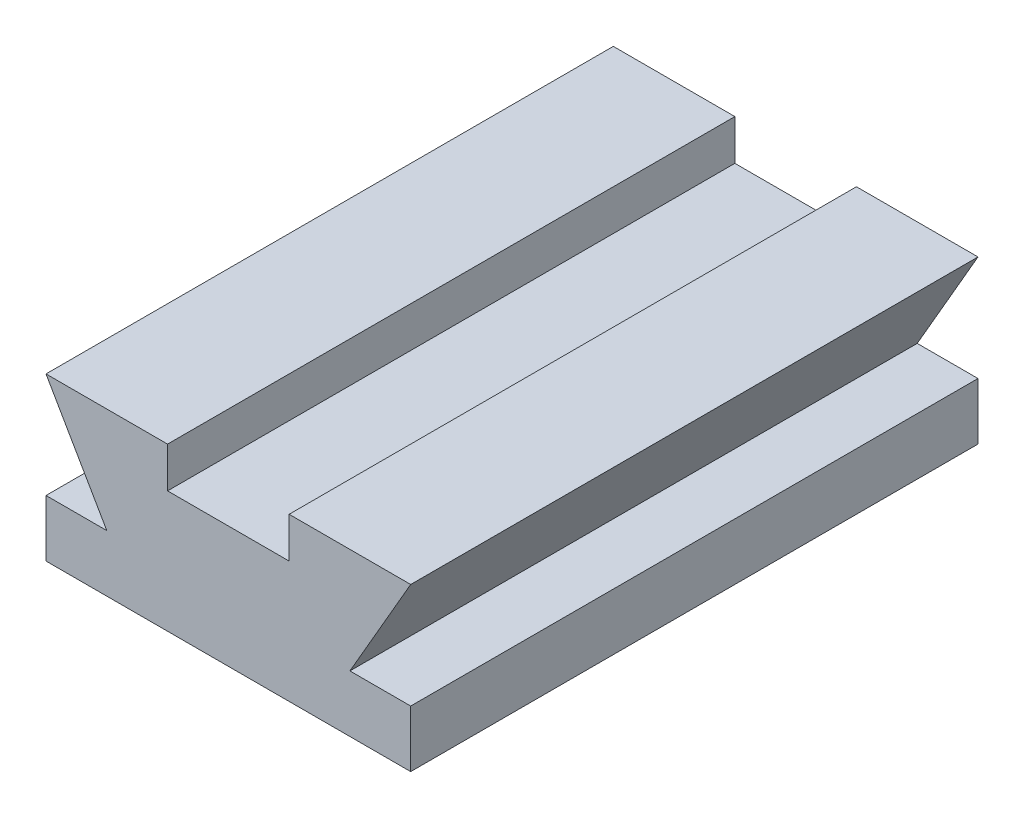
ISO-10303-21;
HEADER;
FILE_DESCRIPTION(('STEP AP214'),'2;1');
FILE_NAME('part.step','',(''),(''),'','','');
FILE_SCHEMA(('AUTOMOTIVE_DESIGN { 1 0 10303 214 1 1 1 1 }'));
ENDSEC;
DATA;
#1=APPLICATION_CONTEXT('core data for automotive mechanical design processes');
#2=APPLICATION_PROTOCOL_DEFINITION('international standard','automotive_design',2000,#1);
#3=PRODUCT_CONTEXT('',#1,'mechanical');
#4=PRODUCT('Part','Part','',(#3));
#5=PRODUCT_RELATED_PRODUCT_CATEGORY('part','',(#4));
#6=PRODUCT_DEFINITION_FORMATION('','',#4);
#7=PRODUCT_DEFINITION_CONTEXT('part definition',#1,'design');
#8=PRODUCT_DEFINITION('design','',#6,#7);
#9=PRODUCT_DEFINITION_SHAPE('','',#8);
#10=(LENGTH_UNIT() NAMED_UNIT(*) SI_UNIT(.MILLI.,.METRE.));
#11=(NAMED_UNIT(*) PLANE_ANGLE_UNIT() SI_UNIT($,.RADIAN.));
#12=(NAMED_UNIT(*) SI_UNIT($,.STERADIAN.) SOLID_ANGLE_UNIT());
#13=UNCERTAINTY_MEASURE_WITH_UNIT(LENGTH_MEASURE(1.E-05),#10,'distance_accuracy_value','');
#14=(GEOMETRIC_REPRESENTATION_CONTEXT(3) GLOBAL_UNCERTAINTY_ASSIGNED_CONTEXT((#13)) GLOBAL_UNIT_ASSIGNED_CONTEXT((#10,
#11,#12)) REPRESENTATION_CONTEXT('',''));
#15=CARTESIAN_POINT('',(0.,0.,0.));
#16=DIRECTION('',(0.,0.,1.));
#17=DIRECTION('',(1.,0.,0.));
#18=AXIS2_PLACEMENT_3D('',#15,#16,#17);
#19=CARTESIAN_POINT('',(0.,2.,0.));
#20=DIRECTION('',(0.,-1.,0.));
#21=DIRECTION('',(0.,0.,-1.));
#22=AXIS2_PLACEMENT_3D('',#19,#20,#21);
#23=PLANE('',#22);
#24=DIRECTION('',(1.,0.,0.));
#25=VECTOR('',#24,1.);
#26=CARTESIAN_POINT('',(-0.617264687132302,2.,-8.85179406139713));
#27=LINE('',#26,#25);
#28=CARTESIAN_POINT('',(2.3827353128677,2.,-8.85179406139713));
#29=VERTEX_POINT('',#28);
#30=CARTESIAN_POINT('',(3.8827353128677,2.,-8.85179406139713));
#31=VERTEX_POINT('',#30);
#32=EDGE_CURVE('E196',#29,#31,#27,.T.);
#33=ORIENTED_EDGE('',*,*,#32,.F.);
#34=DIRECTION('',(0.,0.,-1.));
#35=VECTOR('',#34,1.);
#36=CARTESIAN_POINT('',(2.3827353128677,2.,-1.85179406139713));
#37=LINE('',#36,#35);
#38=CARTESIAN_POINT('',(2.3827353128677,2.,-1.85179406139713));
#39=VERTEX_POINT('',#38);
#40=EDGE_CURVE('E156',#39,#29,#37,.T.);
#41=ORIENTED_EDGE('',*,*,#40,.F.);
#42=DIRECTION('',(1.,0.,0.));
#43=VECTOR('',#42,1.);
#44=CARTESIAN_POINT('',(-0.617264687132302,2.,-1.85179406139713));
#45=LINE('',#44,#43);
#46=CARTESIAN_POINT('',(3.8827353128677,2.,-1.85179406139713));
#47=VERTEX_POINT('',#46);
#48=EDGE_CURVE('E204',#39,#47,#45,.T.);
#49=ORIENTED_EDGE('',*,*,#48,.T.);
#50=DIRECTION('',(0.,0.,-1.));
#51=VECTOR('',#50,1.);
#52=CARTESIAN_POINT('',(3.8827353128677,2.,-1.85179406139713));
#53=LINE('',#52,#51);
#54=EDGE_CURVE('E201',#47,#31,#53,.T.);
#55=ORIENTED_EDGE('',*,*,#54,.T.);
#56=EDGE_LOOP('',(#33,#41,#49,#55));
#57=FACE_BOUND('',#56,.T.);
#58=ADVANCED_FACE('F36',(#57),#23,.F.);
#59=CARTESIAN_POINT('',(-0.617264687132302,2.,-1.85179406139713));
#60=DIRECTION('',(-1.,0.,0.));
#61=DIRECTION('',(0.,0.,1.));
#62=AXIS2_PLACEMENT_3D('',#59,#60,#61);
#63=PLANE('',#62);
#64=DIRECTION('',(0.,0.,-1.));
#65=VECTOR('',#64,1.);
#66=CARTESIAN_POINT('',(-0.617264687132302,0.700961894323355,-1.85179406139713));
#67=LINE('',#66,#65);
#68=CARTESIAN_POINT('',(-0.617264687132302,0.700961894323355,-1.85179406139713));
#69=VERTEX_POINT('',#68);
#70=CARTESIAN_POINT('',(-0.617264687132302,0.700961894323355,-8.85179406139713));
#71=VERTEX_POINT('',#70);
#72=EDGE_CURVE('E136',#69,#71,#67,.T.);
#73=ORIENTED_EDGE('',*,*,#72,.T.);
#74=DIRECTION('',(0.,-1.,0.));
#75=VECTOR('',#74,1.);
#76=CARTESIAN_POINT('',(-0.617264687132302,2.,-8.85179406139713));
#77=LINE('',#76,#75);
#78=CARTESIAN_POINT('',(-0.617264687132302,0.,-8.85179406139713));
#79=VERTEX_POINT('',#78);
#80=EDGE_CURVE('E40',#71,#79,#77,.T.);
#81=ORIENTED_EDGE('',*,*,#80,.T.);
#82=DIRECTION('',(0.,0.,-1.));
#83=VECTOR('',#82,1.);
#84=CARTESIAN_POINT('',(-0.617264687132302,0.,-1.85179406139713));
#85=LINE('',#84,#83);
#86=CARTESIAN_POINT('',(-0.617264687132302,0.,-1.85179406139713));
#87=VERTEX_POINT('',#86);
#88=EDGE_CURVE('E188',#87,#79,#85,.T.);
#89=ORIENTED_EDGE('',*,*,#88,.F.);
#90=DIRECTION('',(0.,-1.,0.));
#91=VECTOR('',#90,1.);
#92=CARTESIAN_POINT('',(-0.617264687132302,2.,-1.85179406139713));
#93=LINE('',#92,#91);
#94=EDGE_CURVE('E11',#69,#87,#93,.T.);
#95=ORIENTED_EDGE('',*,*,#94,.F.);
#96=EDGE_LOOP('',(#73,#81,#89,#95));
#97=FACE_BOUND('',#96,.T.);
#98=ADVANCED_FACE('F38',(#97),#63,.T.);
#99=CARTESIAN_POINT('',(-0.617264687132302,2.,-1.85179406139713));
#100=DIRECTION('',(0.,0.,-1.));
#101=DIRECTION('',(-1.,0.,0.));
#102=AXIS2_PLACEMENT_3D('',#99,#100,#101);
#103=PLANE('',#102);
#104=DIRECTION('',(0.500000000000004,-0.866025403784436,0.));
#105=VECTOR('',#104,1.);
#106=CARTESIAN_POINT('',(-0.617264687132302,2.,-1.85179406139713));
#107=LINE('',#106,#105);
#108=CARTESIAN_POINT('',(-0.617264687132302,2.,-1.85179406139713));
#109=VERTEX_POINT('',#108);
#110=CARTESIAN_POINT('',(0.132735312867698,0.700961894323355,-1.85179406139713));
#111=VERTEX_POINT('',#110);
#112=EDGE_CURVE('E130',#109,#111,#107,.T.);
#113=ORIENTED_EDGE('',*,*,#112,.T.);
#114=DIRECTION('',(-1.,0.,0.));
#115=VECTOR('',#114,1.);
#116=CARTESIAN_POINT('',(0.132735312867698,0.700961894323355,-1.85179406139713));
#117=LINE('',#116,#115);
#118=EDGE_CURVE('E137',#111,#69,#117,.T.);
#119=ORIENTED_EDGE('',*,*,#118,.T.);
#120=ORIENTED_EDGE('',*,*,#94,.T.);
#121=DIRECTION('',(1.,0.,0.));
#122=VECTOR('',#121,1.);
#123=CARTESIAN_POINT('',(-0.617264687132302,0.,-1.85179406139713));
#124=LINE('',#123,#122);
#125=CARTESIAN_POINT('',(3.8827353128677,0.,-1.85179406139713));
#126=VERTEX_POINT('',#125);
#127=EDGE_CURVE('E197',#87,#126,#124,.T.);
#128=ORIENTED_EDGE('',*,*,#127,.T.);
#129=DIRECTION('',(0.,-1.,0.));
#130=VECTOR('',#129,1.);
#131=CARTESIAN_POINT('',(3.8827353128677,2.,-1.85179406139713));
#132=LINE('',#131,#130);
#133=CARTESIAN_POINT('',(3.8827353128677,0.700961894323355,-1.85179406139713));
#134=VERTEX_POINT('',#133);
#135=EDGE_CURVE('E45',#134,#126,#132,.T.);
#136=ORIENTED_EDGE('',*,*,#135,.F.);
#137=DIRECTION('',(-1.,0.,0.));
#138=VECTOR('',#137,1.);
#139=CARTESIAN_POINT('',(3.1327353128677,0.700961894323355,-1.85179406139713));
#140=LINE('',#139,#138);
#141=CARTESIAN_POINT('',(3.1327353128677,0.700961894323355,-1.85179406139713));
#142=VERTEX_POINT('',#141);
#143=EDGE_CURVE('E158',#134,#142,#140,.T.);
#144=ORIENTED_EDGE('',*,*,#143,.T.);
#145=DIRECTION('',(0.500000000000004,0.866025403784437,0.));
#146=VECTOR('',#145,1.);
#147=CARTESIAN_POINT('',(3.8827353128677,2.,-1.85179406139713));
#148=LINE('',#147,#146);
#149=EDGE_CURVE('E161',#142,#47,#148,.T.);
#150=ORIENTED_EDGE('',*,*,#149,.T.);
#151=ORIENTED_EDGE('',*,*,#48,.F.);
#152=DIRECTION('',(0.,1.,0.));
#153=VECTOR('',#152,1.);
#154=CARTESIAN_POINT('',(2.3827353128677,1.5,-1.85179406139713));
#155=LINE('',#154,#153);
#156=CARTESIAN_POINT('',(2.3827353128677,1.5,-1.85179406139713));
#157=VERTEX_POINT('',#156);
#158=EDGE_CURVE('E186',#157,#39,#155,.T.);
#159=ORIENTED_EDGE('',*,*,#158,.F.);
#160=DIRECTION('',(1.,0.,0.));
#161=VECTOR('',#160,1.);
#162=CARTESIAN_POINT('',(2.3827353128677,1.5,-1.85179406139713));
#163=LINE('',#162,#161);
#164=CARTESIAN_POINT('',(0.882735312867698,1.5,-1.85179406139713));
#165=VERTEX_POINT('',#164);
#166=EDGE_CURVE('E180',#165,#157,#163,.T.);
#167=ORIENTED_EDGE('',*,*,#166,.F.);
#168=DIRECTION('',(0.,1.,0.));
#169=VECTOR('',#168,1.);
#170=CARTESIAN_POINT('',(0.882735312867698,1.5,-1.85179406139713));
#171=LINE('',#170,#169);
#172=CARTESIAN_POINT('',(0.882735312867698,2.,-1.85179406139713));
#173=VERTEX_POINT('',#172);
#174=EDGE_CURVE('E189',#165,#173,#171,.T.);
#175=ORIENTED_EDGE('',*,*,#174,.T.);
#176=EDGE_CURVE('E148',#109,#173,#45,.T.);
#177=ORIENTED_EDGE('',*,*,#176,.F.);
#178=EDGE_LOOP('',(#113,#119,#120,#128,#136,#144,#150,#151,#159,#167,#175,#177));
#179=FACE_BOUND('',#178,.T.);
#180=ADVANCED_FACE('F145',(#179),#103,.F.);
#181=CARTESIAN_POINT('',(3.8827353128677,2.,-1.85179406139713));
#182=DIRECTION('',(-1.,0.,0.));
#183=DIRECTION('',(0.,0.,1.));
#184=AXIS2_PLACEMENT_3D('',#181,#182,#183);
#185=PLANE('',#184);
#186=DIRECTION('',(0.,-1.,0.));
#187=VECTOR('',#186,1.);
#188=CARTESIAN_POINT('',(3.8827353128677,2.,-8.85179406139713));
#189=LINE('',#188,#187);
#190=CARTESIAN_POINT('',(3.8827353128677,0.700961894323355,-8.85179406139713));
#191=VERTEX_POINT('',#190);
#192=CARTESIAN_POINT('',(3.8827353128677,0.,-8.85179406139713));
#193=VERTEX_POINT('',#192);
#194=EDGE_CURVE('E216',#191,#193,#189,.T.);
#195=ORIENTED_EDGE('',*,*,#194,.F.);
#196=DIRECTION('',(0.,0.,-1.));
#197=VECTOR('',#196,1.);
#198=CARTESIAN_POINT('',(3.8827353128677,0.700961894323355,-1.85179406139713));
#199=LINE('',#198,#197);
#200=EDGE_CURVE('E53',#134,#191,#199,.T.);
#201=ORIENTED_EDGE('',*,*,#200,.F.);
#202=ORIENTED_EDGE('',*,*,#135,.T.);
#203=DIRECTION('',(0.,0.,-1.));
#204=VECTOR('',#203,1.);
#205=CARTESIAN_POINT('',(3.8827353128677,0.,-1.85179406139713));
#206=LINE('',#205,#204);
#207=EDGE_CURVE('E211',#126,#193,#206,.T.);
#208=ORIENTED_EDGE('',*,*,#207,.T.);
#209=EDGE_LOOP('',(#195,#201,#202,#208));
#210=FACE_BOUND('',#209,.T.);
#211=ADVANCED_FACE('F230',(#210),#185,.F.);
#212=CARTESIAN_POINT('',(-0.617264687132302,2.,-8.85179406139713));
#213=DIRECTION('',(0.,0.,-1.));
#214=DIRECTION('',(-1.,0.,0.));
#215=AXIS2_PLACEMENT_3D('',#212,#213,#214);
#216=PLANE('',#215);
#217=DIRECTION('',(-1.,0.,0.));
#218=VECTOR('',#217,1.);
#219=CARTESIAN_POINT('',(0.132735312867698,0.700961894323355,-8.85179406139713));
#220=LINE('',#219,#218);
#221=CARTESIAN_POINT('',(0.132735312867698,0.700961894323355,-8.85179406139713));
#222=VERTEX_POINT('',#221);
#223=EDGE_CURVE('E150',#222,#71,#220,.T.);
#224=ORIENTED_EDGE('',*,*,#223,.F.);
#225=DIRECTION('',(0.500000000000004,-0.866025403784436,0.));
#226=VECTOR('',#225,1.);
#227=CARTESIAN_POINT('',(-0.617264687132302,2.,-8.85179406139713));
#228=LINE('',#227,#226);
#229=CARTESIAN_POINT('',(-0.617264687132302,2.,-8.85179406139713));
#230=VERTEX_POINT('',#229);
#231=EDGE_CURVE('E133',#230,#222,#228,.T.);
#232=ORIENTED_EDGE('',*,*,#231,.F.);
#233=CARTESIAN_POINT('',(0.882735312867698,2.,-8.85179406139713));
#234=VERTEX_POINT('',#233);
#235=EDGE_CURVE('E198',#230,#234,#27,.T.);
#236=ORIENTED_EDGE('',*,*,#235,.T.);
#237=DIRECTION('',(0.,1.,0.));
#238=VECTOR('',#237,1.);
#239=CARTESIAN_POINT('',(0.882735312867698,1.5,-8.85179406139713));
#240=LINE('',#239,#238);
#241=CARTESIAN_POINT('',(0.882735312867698,1.5,-8.85179406139713));
#242=VERTEX_POINT('',#241);
#243=EDGE_CURVE('E61',#242,#234,#240,.T.);
#244=ORIENTED_EDGE('',*,*,#243,.F.);
#245=DIRECTION('',(-1.,0.,0.));
#246=VECTOR('',#245,1.);
#247=CARTESIAN_POINT('',(2.3827353128677,1.5,-8.85179406139713));
#248=LINE('',#247,#246);
#249=CARTESIAN_POINT('',(2.3827353128677,1.5,-8.85179406139713));
#250=VERTEX_POINT('',#249);
#251=EDGE_CURVE('E173',#250,#242,#248,.T.);
#252=ORIENTED_EDGE('',*,*,#251,.F.);
#253=DIRECTION('',(0.,1.,0.));
#254=VECTOR('',#253,1.);
#255=CARTESIAN_POINT('',(2.3827353128677,1.5,-8.85179406139713));
#256=LINE('',#255,#254);
#257=EDGE_CURVE('E183',#250,#29,#256,.T.);
#258=ORIENTED_EDGE('',*,*,#257,.T.);
#259=ORIENTED_EDGE('',*,*,#32,.T.);
#260=DIRECTION('',(0.500000000000004,0.866025403784437,0.));
#261=VECTOR('',#260,1.);
#262=CARTESIAN_POINT('',(3.8827353128677,2.,-8.85179406139713));
#263=LINE('',#262,#261);
#264=CARTESIAN_POINT('',(3.1327353128677,0.700961894323355,-8.85179406139713));
#265=VERTEX_POINT('',#264);
#266=EDGE_CURVE('E162',#265,#31,#263,.T.);
#267=ORIENTED_EDGE('',*,*,#266,.F.);
#268=DIRECTION('',(-1.,0.,0.));
#269=VECTOR('',#268,1.);
#270=CARTESIAN_POINT('',(3.1327353128677,0.700961894323355,-8.85179406139713));
#271=LINE('',#270,#269);
#272=EDGE_CURVE('E165',#191,#265,#271,.T.);
#273=ORIENTED_EDGE('',*,*,#272,.F.);
#274=ORIENTED_EDGE('',*,*,#194,.T.);
#275=DIRECTION('',(1.,0.,0.));
#276=VECTOR('',#275,1.);
#277=CARTESIAN_POINT('',(-0.617264687132302,0.,-8.85179406139713));
#278=LINE('',#277,#276);
#279=EDGE_CURVE('E208',#79,#193,#278,.T.);
#280=ORIENTED_EDGE('',*,*,#279,.F.);
#281=ORIENTED_EDGE('',*,*,#80,.F.);
#282=EDGE_LOOP('',(#224,#232,#236,#244,#252,#258,#259,#267,#273,#274,#280,#281));
#283=FACE_BOUND('',#282,.T.);
#284=ADVANCED_FACE('F223',(#283),#216,.T.);
#285=ORIENTED_EDGE('',*,*,#176,.T.);
#286=DIRECTION('',(0.,0.,1.));
#287=VECTOR('',#286,1.);
#288=CARTESIAN_POINT('',(0.882735312867698,2.,-1.85179406139713));
#289=LINE('',#288,#287);
#290=EDGE_CURVE('E174',#234,#173,#289,.T.);
#291=ORIENTED_EDGE('',*,*,#290,.F.);
#292=ORIENTED_EDGE('',*,*,#235,.F.);
#293=DIRECTION('',(0.,0.,-1.));
#294=VECTOR('',#293,1.);
#295=CARTESIAN_POINT('',(-0.617264687132302,2.,-1.85179406139713));
#296=LINE('',#295,#294);
#297=EDGE_CURVE('E194',#109,#230,#296,.T.);
#298=ORIENTED_EDGE('',*,*,#297,.F.);
#299=EDGE_LOOP('',(#285,#291,#292,#298));
#300=FACE_BOUND('',#299,.T.);
#301=ADVANCED_FACE('F237',(#300),#23,.F.);
#302=CARTESIAN_POINT('',(0.,0.,0.));
#303=DIRECTION('',(0.,-1.,0.));
#304=DIRECTION('',(0.,0.,-1.));
#305=AXIS2_PLACEMENT_3D('',#302,#303,#304);
#306=PLANE('',#305);
#307=ORIENTED_EDGE('',*,*,#88,.T.);
#308=ORIENTED_EDGE('',*,*,#279,.T.);
#309=ORIENTED_EDGE('',*,*,#207,.F.);
#310=ORIENTED_EDGE('',*,*,#127,.F.);
#311=EDGE_LOOP('',(#307,#308,#309,#310));
#312=FACE_BOUND('',#311,.T.);
#313=ADVANCED_FACE('F227',(#312),#306,.T.);
#314=CARTESIAN_POINT('',(2.3827353128677,1.5,-1.85179406139713));
#315=DIRECTION('',(1.,0.,0.));
#316=DIRECTION('',(0.,0.,-1.));
#317=AXIS2_PLACEMENT_3D('',#314,#315,#316);
#318=PLANE('',#317);
#319=ORIENTED_EDGE('',*,*,#40,.T.);
#320=ORIENTED_EDGE('',*,*,#257,.F.);
#321=DIRECTION('',(0.,0.,-1.));
#322=VECTOR('',#321,1.);
#323=CARTESIAN_POINT('',(2.3827353128677,1.5,-1.85179406139713));
#324=LINE('',#323,#322);
#325=EDGE_CURVE('E170',#157,#250,#324,.T.);
#326=ORIENTED_EDGE('',*,*,#325,.F.);
#327=ORIENTED_EDGE('',*,*,#158,.T.);
#328=EDGE_LOOP('',(#319,#320,#326,#327));
#329=FACE_BOUND('',#328,.T.);
#330=ADVANCED_FACE('F253',(#329),#318,.F.);
#331=CARTESIAN_POINT('',(0.882735312867698,1.5,-1.85179406139713));
#332=DIRECTION('',(-1.,0.,0.));
#333=DIRECTION('',(0.,0.,1.));
#334=AXIS2_PLACEMENT_3D('',#331,#332,#333);
#335=PLANE('',#334);
#336=ORIENTED_EDGE('',*,*,#290,.T.);
#337=ORIENTED_EDGE('',*,*,#174,.F.);
#338=DIRECTION('',(0.,0.,1.));
#339=VECTOR('',#338,1.);
#340=CARTESIAN_POINT('',(0.882735312867698,1.5,-1.85179406139713));
#341=LINE('',#340,#339);
#342=EDGE_CURVE('E177',#242,#165,#341,.T.);
#343=ORIENTED_EDGE('',*,*,#342,.F.);
#344=ORIENTED_EDGE('',*,*,#243,.T.);
#345=EDGE_LOOP('',(#336,#337,#343,#344));
#346=FACE_BOUND('',#345,.T.);
#347=ADVANCED_FACE('F280',(#346),#335,.F.);
#348=CARTESIAN_POINT('',(0.,1.5,0.));
#349=DIRECTION('',(0.,1.,0.));
#350=DIRECTION('',(0.,0.,1.));
#351=AXIS2_PLACEMENT_3D('',#348,#349,#350);
#352=PLANE('',#351);
#353=ORIENTED_EDGE('',*,*,#325,.T.);
#354=ORIENTED_EDGE('',*,*,#251,.T.);
#355=ORIENTED_EDGE('',*,*,#342,.T.);
#356=ORIENTED_EDGE('',*,*,#166,.T.);
#357=EDGE_LOOP('',(#353,#354,#355,#356));
#358=FACE_BOUND('',#357,.T.);
#359=ADVANCED_FACE('F258',(#358),#352,.T.);
#360=CARTESIAN_POINT('',(0.132735312867698,0.700961894323355,-1.85179406139713));
#361=DIRECTION('',(0.,-1.,0.));
#362=DIRECTION('',(0.,0.,-1.));
#363=AXIS2_PLACEMENT_3D('',#360,#361,#362);
#364=PLANE('',#363);
#365=ORIENTED_EDGE('',*,*,#223,.T.);
#366=ORIENTED_EDGE('',*,*,#72,.F.);
#367=ORIENTED_EDGE('',*,*,#118,.F.);
#368=DIRECTION('',(0.,0.,-1.));
#369=VECTOR('',#368,1.);
#370=CARTESIAN_POINT('',(0.132735312867698,0.700961894323355,-1.85179406139713));
#371=LINE('',#370,#369);
#372=EDGE_CURVE('E126',#111,#222,#371,.T.);
#373=ORIENTED_EDGE('',*,*,#372,.T.);
#374=EDGE_LOOP('',(#365,#366,#367,#373));
#375=FACE_BOUND('',#374,.T.);
#376=ADVANCED_FACE('F140',(#375),#364,.F.);
#377=CARTESIAN_POINT('',(-0.617264687132302,2.,-1.85179406139713));
#378=DIRECTION('',(0.866025403784437,0.500000000000004,0.));
#379=DIRECTION('',(-0.500000000000004,0.866025403784437,0.));
#380=AXIS2_PLACEMENT_3D('',#377,#378,#379);
#381=PLANE('',#380);
#382=ORIENTED_EDGE('',*,*,#231,.T.);
#383=ORIENTED_EDGE('',*,*,#372,.F.);
#384=ORIENTED_EDGE('',*,*,#112,.F.);
#385=ORIENTED_EDGE('',*,*,#297,.T.);
#386=EDGE_LOOP('',(#382,#383,#384,#385));
#387=FACE_BOUND('',#386,.T.);
#388=ADVANCED_FACE('F128',(#387),#381,.F.);
#389=CARTESIAN_POINT('',(3.8827353128677,2.,-1.85179406139713));
#390=DIRECTION('',(-0.866025403784437,0.500000000000003,0.));
#391=DIRECTION('',(-0.500000000000004,-0.866025403784437,0.));
#392=AXIS2_PLACEMENT_3D('',#389,#390,#391);
#393=PLANE('',#392);
#394=ORIENTED_EDGE('',*,*,#266,.T.);
#395=ORIENTED_EDGE('',*,*,#54,.F.);
#396=ORIENTED_EDGE('',*,*,#149,.F.);
#397=DIRECTION('',(0.,0.,-1.));
#398=VECTOR('',#397,1.);
#399=CARTESIAN_POINT('',(3.1327353128677,0.700961894323355,-1.85179406139713));
#400=LINE('',#399,#398);
#401=EDGE_CURVE('E154',#142,#265,#400,.T.);
#402=ORIENTED_EDGE('',*,*,#401,.T.);
#403=EDGE_LOOP('',(#394,#395,#396,#402));
#404=FACE_BOUND('',#403,.T.);
#405=ADVANCED_FACE('F267',(#404),#393,.F.);
#406=CARTESIAN_POINT('',(3.1327353128677,0.700961894323355,-1.85179406139713));
#407=DIRECTION('',(0.,-1.,0.));
#408=DIRECTION('',(0.,0.,-1.));
#409=AXIS2_PLACEMENT_3D('',#406,#407,#408);
#410=PLANE('',#409);
#411=ORIENTED_EDGE('',*,*,#272,.T.);
#412=ORIENTED_EDGE('',*,*,#401,.F.);
#413=ORIENTED_EDGE('',*,*,#143,.F.);
#414=ORIENTED_EDGE('',*,*,#200,.T.);
#415=EDGE_LOOP('',(#411,#412,#413,#414));
#416=FACE_BOUND('',#415,.T.);
#417=ADVANCED_FACE('F269',(#416),#410,.F.);
#418=CLOSED_SHELL('',(#58,#98,#180,#211,#284,#301,#313,#330,#347,#359,#376,#388,#405,#417));
#419=MANIFOLD_SOLID_BREP('B2',#418);
#420=ADVANCED_BREP_SHAPE_REPRESENTATION('',(#18,#419),#14);
#421=SHAPE_DEFINITION_REPRESENTATION(#9,#420);
ENDSEC;
END-ISO-10303-21;
